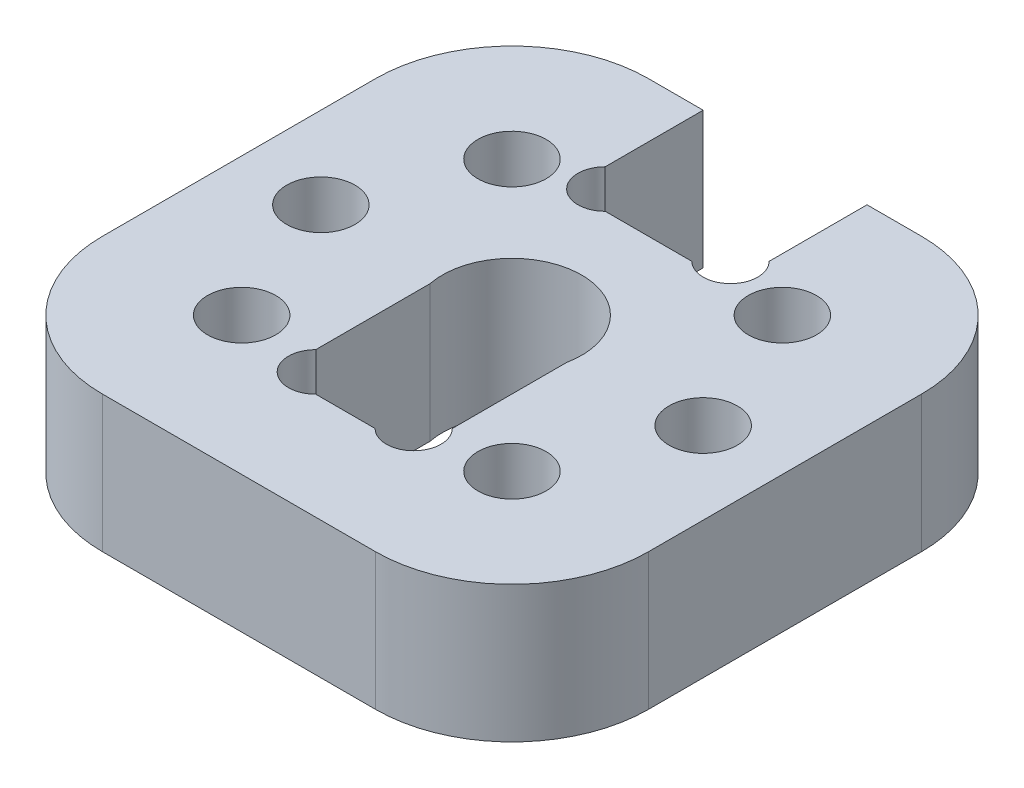
ISO-10303-21;
HEADER;
FILE_DESCRIPTION(('STEP AP214'),'2;1');
FILE_NAME('part.step','',(''),(''),'','','');
FILE_SCHEMA(('AUTOMOTIVE_DESIGN { 1 0 10303 214 1 1 1 1 }'));
ENDSEC;
DATA;
#1=APPLICATION_CONTEXT('core data for automotive mechanical design processes');
#2=APPLICATION_PROTOCOL_DEFINITION('international standard','automotive_design',2000,#1);
#3=PRODUCT_CONTEXT('',#1,'mechanical');
#4=PRODUCT('Part','Part','',(#3));
#5=PRODUCT_RELATED_PRODUCT_CATEGORY('part','',(#4));
#6=PRODUCT_DEFINITION_FORMATION('','',#4);
#7=PRODUCT_DEFINITION_CONTEXT('part definition',#1,'design');
#8=PRODUCT_DEFINITION('design','',#6,#7);
#9=PRODUCT_DEFINITION_SHAPE('','',#8);
#10=(LENGTH_UNIT() NAMED_UNIT(*) SI_UNIT(.MILLI.,.METRE.));
#11=(NAMED_UNIT(*) PLANE_ANGLE_UNIT() SI_UNIT($,.RADIAN.));
#12=(NAMED_UNIT(*) SI_UNIT($,.STERADIAN.) SOLID_ANGLE_UNIT());
#13=UNCERTAINTY_MEASURE_WITH_UNIT(LENGTH_MEASURE(1.E-05),#10,'distance_accuracy_value','');
#14=(GEOMETRIC_REPRESENTATION_CONTEXT(3) GLOBAL_UNCERTAINTY_ASSIGNED_CONTEXT((#13)) GLOBAL_UNIT_ASSIGNED_CONTEXT((#10,
#11,#12)) REPRESENTATION_CONTEXT('',''));
#15=CARTESIAN_POINT('',(0.,0.,0.));
#16=DIRECTION('',(0.,0.,1.));
#17=DIRECTION('',(1.,0.,0.));
#18=AXIS2_PLACEMENT_3D('',#15,#16,#17);
#19=CARTESIAN_POINT('',(-10.,5.,-9.99999999999999));
#20=DIRECTION('',(0.,0.,1.));
#21=DIRECTION('',(1.,0.,0.));
#22=AXIS2_PLACEMENT_3D('',#19,#20,#21);
#23=PLANE('',#22);
#24=DIRECTION('',(-1.,0.,0.));
#25=VECTOR('',#24,1.);
#26=CARTESIAN_POINT('',(-10.,5.,-9.99999999999999));
#27=LINE('',#26,#25);
#28=CARTESIAN_POINT('',(-3.,5.,-9.99999999999999));
#29=VERTEX_POINT('',#28);
#30=CARTESIAN_POINT('',(-5.00000000000001,5.,-9.99999999999999));
#31=VERTEX_POINT('',#30);
#32=EDGE_CURVE('E249',#29,#31,#27,.T.);
#33=ORIENTED_EDGE('',*,*,#32,.F.);
#34=DIRECTION('',(0.,-1.,0.));
#35=VECTOR('',#34,1.);
#36=CARTESIAN_POINT('',(-3.,10.,-9.99999999999999));
#37=LINE('',#36,#35);
#38=CARTESIAN_POINT('',(-3.,0.,-9.99999999999999));
#39=VERTEX_POINT('',#38);
#40=EDGE_CURVE('E190',#29,#39,#37,.T.);
#41=ORIENTED_EDGE('',*,*,#40,.T.);
#42=DIRECTION('',(-1.,0.,0.));
#43=VECTOR('',#42,1.);
#44=CARTESIAN_POINT('',(-10.,0.,-9.99999999999999));
#45=LINE('',#44,#43);
#46=CARTESIAN_POINT('',(-5.00000000000001,0.,-9.99999999999999));
#47=VERTEX_POINT('',#46);
#48=EDGE_CURVE('E263',#39,#47,#45,.T.);
#49=ORIENTED_EDGE('',*,*,#48,.T.);
#50=DIRECTION('',(0.,-1.,0.));
#51=VECTOR('',#50,1.);
#52=CARTESIAN_POINT('',(-5.00000000000001,5.,-9.99999999999999));
#53=LINE('',#52,#51);
#54=EDGE_CURVE('E283',#47,#31,#53,.F.);
#55=ORIENTED_EDGE('',*,*,#54,.T.);
#56=EDGE_LOOP('',(#33,#41,#49,#55));
#57=FACE_BOUND('',#56,.T.);
#58=ADVANCED_FACE('F35',(#57),#23,.F.);
#59=CARTESIAN_POINT('',(9.99999999999999,5.,10.));
#60=DIRECTION('',(-1.,0.,0.));
#61=DIRECTION('',(0.,0.,1.));
#62=AXIS2_PLACEMENT_3D('',#59,#60,#61);
#63=PLANE('',#62);
#64=DIRECTION('',(0.,0.,-1.));
#65=VECTOR('',#64,1.);
#66=CARTESIAN_POINT('',(9.99999999999999,0.,10.));
#67=LINE('',#66,#65);
#68=CARTESIAN_POINT('',(9.99999999999999,0.,5.00000000000001));
#69=VERTEX_POINT('',#68);
#70=CARTESIAN_POINT('',(9.99999999999999,0.,-4.99999999999999));
#71=VERTEX_POINT('',#70);
#72=EDGE_CURVE('E243',#69,#71,#67,.T.);
#73=ORIENTED_EDGE('',*,*,#72,.T.);
#74=DIRECTION('',(0.,-1.,0.));
#75=VECTOR('',#74,1.);
#76=CARTESIAN_POINT('',(9.99999999999999,5.,-4.99999999999999));
#77=LINE('',#76,#75);
#78=CARTESIAN_POINT('',(9.99999999999999,5.,-4.99999999999999));
#79=VERTEX_POINT('',#78);
#80=EDGE_CURVE('E301',#71,#79,#77,.F.);
#81=ORIENTED_EDGE('',*,*,#80,.T.);
#82=DIRECTION('',(0.,0.,-1.));
#83=VECTOR('',#82,1.);
#84=CARTESIAN_POINT('',(9.99999999999999,5.,10.));
#85=LINE('',#84,#83);
#86=CARTESIAN_POINT('',(9.99999999999999,5.,5.00000000000001));
#87=VERTEX_POINT('',#86);
#88=EDGE_CURVE('E246',#87,#79,#85,.T.);
#89=ORIENTED_EDGE('',*,*,#88,.F.);
#90=DIRECTION('',(0.,-1.,0.));
#91=VECTOR('',#90,1.);
#92=CARTESIAN_POINT('',(9.99999999999999,5.,5.00000000000001));
#93=LINE('',#92,#91);
#94=EDGE_CURVE('E298',#87,#69,#93,.T.);
#95=ORIENTED_EDGE('',*,*,#94,.T.);
#96=EDGE_LOOP('',(#73,#81,#89,#95));
#97=FACE_BOUND('',#96,.T.);
#98=ADVANCED_FACE('F337',(#97),#63,.F.);
#99=CARTESIAN_POINT('',(4.99999999999999,0.,-9.99999999999999));
#100=VERTEX_POINT('',#99);
#101=CARTESIAN_POINT('',(3.,0.,-9.99999999999999));
#102=VERTEX_POINT('',#101);
#103=EDGE_CURVE('E264',#100,#102,#45,.T.);
#104=ORIENTED_EDGE('',*,*,#103,.T.);
#105=DIRECTION('',(0.,-1.,0.));
#106=VECTOR('',#105,1.);
#107=CARTESIAN_POINT('',(3.,10.,-9.99999999999999));
#108=LINE('',#107,#106);
#109=CARTESIAN_POINT('',(3.,5.,-9.99999999999999));
#110=VERTEX_POINT('',#109);
#111=EDGE_CURVE('E194',#110,#102,#108,.T.);
#112=ORIENTED_EDGE('',*,*,#111,.F.);
#113=CARTESIAN_POINT('',(4.99999999999999,5.,-9.99999999999999));
#114=VERTEX_POINT('',#113);
#115=EDGE_CURVE('E251',#114,#110,#27,.T.);
#116=ORIENTED_EDGE('',*,*,#115,.F.);
#117=DIRECTION('',(0.,-1.,0.));
#118=VECTOR('',#117,1.);
#119=CARTESIAN_POINT('',(4.99999999999999,5.,-9.99999999999999));
#120=LINE('',#119,#118);
#121=EDGE_CURVE('E286',#114,#100,#120,.T.);
#122=ORIENTED_EDGE('',*,*,#121,.T.);
#123=EDGE_LOOP('',(#104,#112,#116,#122));
#124=FACE_BOUND('',#123,.T.);
#125=ADVANCED_FACE('F330',(#124),#23,.F.);
#126=CARTESIAN_POINT('',(-10.,5.,10.));
#127=DIRECTION('',(1.,0.,0.));
#128=DIRECTION('',(0.,0.,-1.));
#129=AXIS2_PLACEMENT_3D('',#126,#127,#128);
#130=PLANE('',#129);
#131=DIRECTION('',(0.,0.,1.));
#132=VECTOR('',#131,1.);
#133=CARTESIAN_POINT('',(-10.,5.,10.));
#134=LINE('',#133,#132);
#135=CARTESIAN_POINT('',(-10.,5.,-4.99999999999999));
#136=VERTEX_POINT('',#135);
#137=CARTESIAN_POINT('',(-10.,5.,5.00000000000001));
#138=VERTEX_POINT('',#137);
#139=EDGE_CURVE('E254',#136,#138,#134,.T.);
#140=ORIENTED_EDGE('',*,*,#139,.F.);
#141=DIRECTION('',(0.,-1.,0.));
#142=VECTOR('',#141,1.);
#143=CARTESIAN_POINT('',(-10.,5.,-4.99999999999999));
#144=LINE('',#143,#142);
#145=CARTESIAN_POINT('',(-10.,0.,-4.99999999999999));
#146=VERTEX_POINT('',#145);
#147=EDGE_CURVE('E313',#136,#146,#144,.T.);
#148=ORIENTED_EDGE('',*,*,#147,.T.);
#149=DIRECTION('',(0.,0.,1.));
#150=VECTOR('',#149,1.);
#151=CARTESIAN_POINT('',(-10.,0.,10.));
#152=LINE('',#151,#150);
#153=CARTESIAN_POINT('',(-10.,0.,5.00000000000001));
#154=VERTEX_POINT('',#153);
#155=EDGE_CURVE('E267',#146,#154,#152,.T.);
#156=ORIENTED_EDGE('',*,*,#155,.T.);
#157=DIRECTION('',(0.,-1.,0.));
#158=VECTOR('',#157,1.);
#159=CARTESIAN_POINT('',(-10.,5.,5.00000000000001));
#160=LINE('',#159,#158);
#161=EDGE_CURVE('E311',#154,#138,#160,.F.);
#162=ORIENTED_EDGE('',*,*,#161,.T.);
#163=EDGE_LOOP('',(#140,#148,#156,#162));
#164=FACE_BOUND('',#163,.T.);
#165=ADVANCED_FACE('F355',(#164),#130,.F.);
#166=CARTESIAN_POINT('',(-10.,5.,10.));
#167=DIRECTION('',(0.,0.,-1.));
#168=DIRECTION('',(-1.,0.,0.));
#169=AXIS2_PLACEMENT_3D('',#166,#167,#168);
#170=PLANE('',#169);
#171=DIRECTION('',(1.,0.,0.));
#172=VECTOR('',#171,1.);
#173=CARTESIAN_POINT('',(-10.,5.,10.));
#174=LINE('',#173,#172);
#175=CARTESIAN_POINT('',(-5.00000000000001,5.,10.));
#176=VERTEX_POINT('',#175);
#177=CARTESIAN_POINT('',(4.99999999999999,5.,10.));
#178=VERTEX_POINT('',#177);
#179=EDGE_CURVE('E257',#176,#178,#174,.T.);
#180=ORIENTED_EDGE('',*,*,#179,.F.);
#181=DIRECTION('',(0.,-1.,0.));
#182=VECTOR('',#181,1.);
#183=CARTESIAN_POINT('',(-5.00000000000001,5.,10.));
#184=LINE('',#183,#182);
#185=CARTESIAN_POINT('',(-5.00000000000001,0.,10.));
#186=VERTEX_POINT('',#185);
#187=EDGE_CURVE('E318',#176,#186,#184,.T.);
#188=ORIENTED_EDGE('',*,*,#187,.T.);
#189=DIRECTION('',(1.,0.,0.));
#190=VECTOR('',#189,1.);
#191=CARTESIAN_POINT('',(-10.,0.,10.));
#192=LINE('',#191,#190);
#193=CARTESIAN_POINT('',(4.99999999999999,0.,10.));
#194=VERTEX_POINT('',#193);
#195=EDGE_CURVE('E250',#186,#194,#192,.T.);
#196=ORIENTED_EDGE('',*,*,#195,.T.);
#197=DIRECTION('',(0.,-1.,0.));
#198=VECTOR('',#197,1.);
#199=CARTESIAN_POINT('',(4.99999999999999,5.,10.));
#200=LINE('',#199,#198);
#201=EDGE_CURVE('E316',#194,#178,#200,.F.);
#202=ORIENTED_EDGE('',*,*,#201,.T.);
#203=EDGE_LOOP('',(#180,#188,#196,#202));
#204=FACE_BOUND('',#203,.T.);
#205=ADVANCED_FACE('F346',(#204),#170,.F.);
#206=CARTESIAN_POINT('',(0.,5.,0.));
#207=DIRECTION('',(0.,-1.,0.));
#208=DIRECTION('',(0.,0.,-1.));
#209=AXIS2_PLACEMENT_3D('',#206,#207,#208);
#210=PLANE('',#209);
#211=CARTESIAN_POINT('',(-4.94974746830586,5.,4.94974746830416));
#212=DIRECTION('',(0.,-1.,0.));
#213=DIRECTION('',(0.,0.,-1.));
#214=AXIS2_PLACEMENT_3D('',#211,#212,#213);
#215=CIRCLE('',#214,1.2500000000001);
#216=CARTESIAN_POINT('',(-4.94974746830586,5.,3.69974746830406));
#217=VERTEX_POINT('',#216);
#218=EDGE_CURVE('E402',#217,#217,#215,.T.);
#219=ORIENTED_EDGE('',*,*,#218,.T.);
#220=EDGE_LOOP('',(#219));
#221=FACE_BOUND('',#220,.T.);
#222=CARTESIAN_POINT('',(-6.99999999999918,5.,-2.02008441066855E-12));
#223=DIRECTION('',(0.,-1.,0.));
#224=DIRECTION('',(0.,0.,-1.));
#225=AXIS2_PLACEMENT_3D('',#222,#223,#224);
#226=CIRCLE('',#225,1.25000000000021);
#227=CARTESIAN_POINT('',(-6.99999999999918,5.,-1.25000000000223));
#228=VERTEX_POINT('',#227);
#229=EDGE_CURVE('E396',#228,#228,#226,.T.);
#230=ORIENTED_EDGE('',*,*,#229,.T.);
#231=EDGE_LOOP('',(#230));
#232=FACE_BOUND('',#231,.T.);
#233=CARTESIAN_POINT('',(-4.94974746830417,5.,-4.9497474683075));
#234=DIRECTION('',(0.,-1.,0.));
#235=DIRECTION('',(0.,0.,-1.));
#236=AXIS2_PLACEMENT_3D('',#233,#234,#235);
#237=CIRCLE('',#236,1.25000000000019);
#238=CARTESIAN_POINT('',(-4.94974746830417,5.,-6.19974746830769));
#239=VERTEX_POINT('',#238);
#240=EDGE_CURVE('E390',#239,#239,#237,.T.);
#241=ORIENTED_EDGE('',*,*,#240,.T.);
#242=EDGE_LOOP('',(#241));
#243=FACE_BOUND('',#242,.T.);
#244=CARTESIAN_POINT('',(4.9497474683075,5.,-4.94974746830581));
#245=DIRECTION('',(0.,-1.,0.));
#246=DIRECTION('',(0.,0.,-1.));
#247=AXIS2_PLACEMENT_3D('',#244,#245,#246);
#248=CIRCLE('',#247,1.2499999999999);
#249=CARTESIAN_POINT('',(4.9497474683075,5.,-6.19974746830571));
#250=VERTEX_POINT('',#249);
#251=EDGE_CURVE('E384',#250,#250,#248,.T.);
#252=ORIENTED_EDGE('',*,*,#251,.T.);
#253=EDGE_LOOP('',(#252));
#254=FACE_BOUND('',#253,.T.);
#255=CARTESIAN_POINT('',(7.00000000000082,5.,3.77099601951891E-13));
#256=DIRECTION('',(0.,-1.,0.));
#257=DIRECTION('',(0.,0.,-1.));
#258=AXIS2_PLACEMENT_3D('',#255,#256,#257);
#259=CIRCLE('',#258,1.24999999999979);
#260=CARTESIAN_POINT('',(7.00000000000082,5.,-1.24999999999941));
#261=VERTEX_POINT('',#260);
#262=EDGE_CURVE('E378',#261,#261,#259,.T.);
#263=ORIENTED_EDGE('',*,*,#262,.T.);
#264=EDGE_LOOP('',(#263));
#265=FACE_BOUND('',#264,.T.);
#266=CARTESIAN_POINT('',(4.94974746830581,5.,4.94974746830586));
#267=DIRECTION('',(0.,-1.,0.));
#268=DIRECTION('',(0.,0.,-1.));
#269=AXIS2_PLACEMENT_3D('',#266,#267,#268);
#270=CIRCLE('',#269,1.24999999999981);
#271=CARTESIAN_POINT('',(4.94974746830581,5.,3.69974746830605));
#272=VERTEX_POINT('',#271);
#273=EDGE_CURVE('E181',#272,#272,#270,.T.);
#274=ORIENTED_EDGE('',*,*,#273,.T.);
#275=EDGE_LOOP('',(#274));
#276=FACE_BOUND('',#275,.T.);
#277=DIRECTION('',(-1.,0.,0.));
#278=VECTOR('',#277,1.);
#279=CARTESIAN_POINT('',(-2.50000000000006,5.,6.10000000000002));
#280=LINE('',#279,#278);
#281=CARTESIAN_POINT('',(1.08578643762685,5.,6.10000000000002));
#282=VERTEX_POINT('',#281);
#283=CARTESIAN_POINT('',(-1.08578643762696,5.,6.10000000000002));
#284=VERTEX_POINT('',#283);
#285=EDGE_CURVE('E230',#282,#284,#280,.T.);
#286=ORIENTED_EDGE('',*,*,#285,.T.);
#287=CARTESIAN_POINT('',(-1.79289321881351,5.,5.39289321881347));
#288=DIRECTION('',(0.,-1.,0.));
#289=DIRECTION('',(0.,0.,-1.));
#290=AXIS2_PLACEMENT_3D('',#287,#288,#289);
#291=CIRCLE('',#290,1.);
#292=CARTESIAN_POINT('',(-2.50000000000006,5.,4.68578643762693));
#293=VERTEX_POINT('',#292);
#294=EDGE_CURVE('E210',#284,#293,#291,.T.);
#295=ORIENTED_EDGE('',*,*,#294,.T.);
#296=DIRECTION('',(0.,0.,-1.));
#297=VECTOR('',#296,1.);
#298=CARTESIAN_POINT('',(-2.50000000000006,5.,6.10000000000002));
#299=LINE('',#298,#297);
#300=CARTESIAN_POINT('',(-2.50000000000006,5.,0.50249378105576));
#301=VERTEX_POINT('',#300);
#302=EDGE_CURVE('E224',#293,#301,#299,.T.);
#303=ORIENTED_EDGE('',*,*,#302,.T.);
#304=CARTESIAN_POINT('',(0.,5.,0.));
#305=DIRECTION('',(0.,1.,0.));
#306=DIRECTION('',(0.,0.,1.));
#307=AXIS2_PLACEMENT_3D('',#304,#305,#306);
#308=CIRCLE('',#307,2.55);
#309=CARTESIAN_POINT('',(2.49999999999994,5.,0.502493781056325));
#310=VERTEX_POINT('',#309);
#311=EDGE_CURVE('E233',#310,#301,#308,.T.);
#312=ORIENTED_EDGE('',*,*,#311,.F.);
#313=DIRECTION('',(0.,0.,1.));
#314=VECTOR('',#313,1.);
#315=CARTESIAN_POINT('',(2.49999999999994,5.,6.10000000000002));
#316=LINE('',#315,#314);
#317=CARTESIAN_POINT('',(2.49999999999994,5.,4.68578643762692));
#318=VERTEX_POINT('',#317);
#319=EDGE_CURVE('E226',#310,#318,#316,.T.);
#320=ORIENTED_EDGE('',*,*,#319,.T.);
#321=CARTESIAN_POINT('',(1.7928932188134,5.,5.39289321881347));
#322=DIRECTION('',(0.,-1.,0.));
#323=DIRECTION('',(0.,0.,-1.));
#324=AXIS2_PLACEMENT_3D('',#321,#322,#323);
#325=CIRCLE('',#324,1.);
#326=EDGE_CURVE('E219',#318,#282,#325,.T.);
#327=ORIENTED_EDGE('',*,*,#326,.T.);
#328=EDGE_LOOP('',(#286,#295,#303,#312,#320,#327));
#329=FACE_BOUND('',#328,.T.);
#330=DIRECTION('',(-1.,0.,0.));
#331=VECTOR('',#330,1.);
#332=CARTESIAN_POINT('',(0.,5.,-4.99999999999999));
#333=LINE('',#332,#331);
#334=CARTESIAN_POINT('',(1.58578643762691,5.,-4.99999999999999));
#335=VERTEX_POINT('',#334);
#336=CARTESIAN_POINT('',(-1.58578643762689,5.,-4.99999999999999));
#337=VERTEX_POINT('',#336);
#338=EDGE_CURVE('E204',#335,#337,#333,.T.);
#339=ORIENTED_EDGE('',*,*,#338,.T.);
#340=CARTESIAN_POINT('',(-2.29289321881344,5.,-5.70710678118654));
#341=DIRECTION('',(0.,-1.,0.));
#342=DIRECTION('',(0.,0.,-1.));
#343=AXIS2_PLACEMENT_3D('',#340,#341,#342);
#344=CIRCLE('',#343,0.999999999999999);
#345=CARTESIAN_POINT('',(-3.,5.,-6.41421356237308));
#346=VERTEX_POINT('',#345);
#347=EDGE_CURVE('E50',#337,#346,#344,.T.);
#348=ORIENTED_EDGE('',*,*,#347,.T.);
#349=DIRECTION('',(0.,0.,-1.));
#350=VECTOR('',#349,1.);
#351=CARTESIAN_POINT('',(-3.,5.,0.));
#352=LINE('',#351,#350);
#353=EDGE_CURVE('E206',#346,#29,#352,.T.);
#354=ORIENTED_EDGE('',*,*,#353,.T.);
#355=ORIENTED_EDGE('',*,*,#32,.T.);
#356=CARTESIAN_POINT('',(-5.00000000000001,5.,-4.99999999999999));
#357=DIRECTION('',(0.,-1.,0.));
#358=DIRECTION('',(0.,0.,-1.));
#359=AXIS2_PLACEMENT_3D('',#356,#357,#358);
#360=CIRCLE('',#359,5.);
#361=EDGE_CURVE('E307',#31,#136,#360,.F.);
#362=ORIENTED_EDGE('',*,*,#361,.T.);
#363=ORIENTED_EDGE('',*,*,#139,.T.);
#364=CARTESIAN_POINT('',(-5.00000000000001,5.,5.00000000000001));
#365=DIRECTION('',(0.,-1.,0.));
#366=DIRECTION('',(0.,0.,-1.));
#367=AXIS2_PLACEMENT_3D('',#364,#365,#366);
#368=CIRCLE('',#367,5.);
#369=EDGE_CURVE('E305',#138,#176,#368,.F.);
#370=ORIENTED_EDGE('',*,*,#369,.T.);
#371=ORIENTED_EDGE('',*,*,#179,.T.);
#372=CARTESIAN_POINT('',(4.99999999999999,5.,5.00000000000001));
#373=DIRECTION('',(0.,-1.,0.));
#374=DIRECTION('',(0.,0.,-1.));
#375=AXIS2_PLACEMENT_3D('',#372,#373,#374);
#376=CIRCLE('',#375,5.);
#377=EDGE_CURVE('E303',#178,#87,#376,.F.);
#378=ORIENTED_EDGE('',*,*,#377,.T.);
#379=ORIENTED_EDGE('',*,*,#88,.T.);
#380=CARTESIAN_POINT('',(4.99999999999999,5.,-4.99999999999999));
#381=DIRECTION('',(0.,-1.,0.));
#382=DIRECTION('',(0.,0.,-1.));
#383=AXIS2_PLACEMENT_3D('',#380,#381,#382);
#384=CIRCLE('',#383,5.);
#385=EDGE_CURVE('E309',#79,#114,#384,.F.);
#386=ORIENTED_EDGE('',*,*,#385,.T.);
#387=ORIENTED_EDGE('',*,*,#115,.T.);
#388=DIRECTION('',(0.,0.,1.));
#389=VECTOR('',#388,1.);
#390=CARTESIAN_POINT('',(3.,5.,0.));
#391=LINE('',#390,#389);
#392=CARTESIAN_POINT('',(3.,5.,-6.41421356237309));
#393=VERTEX_POINT('',#392);
#394=EDGE_CURVE('E200',#110,#393,#391,.T.);
#395=ORIENTED_EDGE('',*,*,#394,.T.);
#396=CARTESIAN_POINT('',(2.29289321881346,5.,-5.70710678118654));
#397=DIRECTION('',(0.,-1.,0.));
#398=DIRECTION('',(0.,0.,-1.));
#399=AXIS2_PLACEMENT_3D('',#396,#397,#398);
#400=CIRCLE('',#399,1.);
#401=EDGE_CURVE('E57',#393,#335,#400,.T.);
#402=ORIENTED_EDGE('',*,*,#401,.T.);
#403=EDGE_LOOP('',(#339,#348,#354,#355,#362,#363,#370,#371,#378,#379,#386,#387,#395,#402));
#404=FACE_BOUND('',#403,.T.);
#405=ADVANCED_FACE('F325',(#221,#232,#243,#254,#265,#276,#329,#404),#210,.F.);
#406=CARTESIAN_POINT('',(0.,0.,0.));
#407=DIRECTION('',(0.,-1.,0.));
#408=DIRECTION('',(0.,0.,-1.));
#409=AXIS2_PLACEMENT_3D('',#406,#407,#408);
#410=PLANE('',#409);
#411=CARTESIAN_POINT('',(-4.94974746830586,0.,4.94974746830416));
#412=DIRECTION('',(0.,-1.,0.));
#413=DIRECTION('',(0.,0.,-1.));
#414=AXIS2_PLACEMENT_3D('',#411,#412,#413);
#415=CIRCLE('',#414,1.2500000000001);
#416=CARTESIAN_POINT('',(-4.94974746830586,0.,3.69974746830406));
#417=VERTEX_POINT('',#416);
#418=EDGE_CURVE('E405',#417,#417,#415,.T.);
#419=ORIENTED_EDGE('',*,*,#418,.F.);
#420=EDGE_LOOP('',(#419));
#421=FACE_BOUND('',#420,.T.);
#422=CARTESIAN_POINT('',(-6.99999999999918,0.,-2.02008441066855E-12));
#423=DIRECTION('',(0.,-1.,0.));
#424=DIRECTION('',(0.,0.,-1.));
#425=AXIS2_PLACEMENT_3D('',#422,#423,#424);
#426=CIRCLE('',#425,1.25000000000021);
#427=CARTESIAN_POINT('',(-6.99999999999918,0.,-1.25000000000223));
#428=VERTEX_POINT('',#427);
#429=EDGE_CURVE('E399',#428,#428,#426,.T.);
#430=ORIENTED_EDGE('',*,*,#429,.F.);
#431=EDGE_LOOP('',(#430));
#432=FACE_BOUND('',#431,.T.);
#433=CARTESIAN_POINT('',(-4.94974746830417,0.,-4.9497474683075));
#434=DIRECTION('',(0.,-1.,0.));
#435=DIRECTION('',(0.,0.,-1.));
#436=AXIS2_PLACEMENT_3D('',#433,#434,#435);
#437=CIRCLE('',#436,1.25000000000019);
#438=CARTESIAN_POINT('',(-4.94974746830417,0.,-6.19974746830769));
#439=VERTEX_POINT('',#438);
#440=EDGE_CURVE('E393',#439,#439,#437,.T.);
#441=ORIENTED_EDGE('',*,*,#440,.F.);
#442=EDGE_LOOP('',(#441));
#443=FACE_BOUND('',#442,.T.);
#444=CARTESIAN_POINT('',(4.9497474683075,0.,-4.94974746830581));
#445=DIRECTION('',(0.,-1.,0.));
#446=DIRECTION('',(0.,0.,-1.));
#447=AXIS2_PLACEMENT_3D('',#444,#445,#446);
#448=CIRCLE('',#447,1.2499999999999);
#449=CARTESIAN_POINT('',(4.9497474683075,0.,-6.19974746830571));
#450=VERTEX_POINT('',#449);
#451=EDGE_CURVE('E387',#450,#450,#448,.T.);
#452=ORIENTED_EDGE('',*,*,#451,.F.);
#453=EDGE_LOOP('',(#452));
#454=FACE_BOUND('',#453,.T.);
#455=CARTESIAN_POINT('',(7.00000000000082,0.,3.77099601951891E-13));
#456=DIRECTION('',(0.,-1.,0.));
#457=DIRECTION('',(0.,0.,-1.));
#458=AXIS2_PLACEMENT_3D('',#455,#456,#457);
#459=CIRCLE('',#458,1.24999999999979);
#460=CARTESIAN_POINT('',(7.00000000000082,0.,-1.24999999999941));
#461=VERTEX_POINT('',#460);
#462=EDGE_CURVE('E381',#461,#461,#459,.T.);
#463=ORIENTED_EDGE('',*,*,#462,.F.);
#464=EDGE_LOOP('',(#463));
#465=FACE_BOUND('',#464,.T.);
#466=CARTESIAN_POINT('',(4.94974746830581,0.,4.94974746830586));
#467=DIRECTION('',(0.,-1.,0.));
#468=DIRECTION('',(0.,0.,-1.));
#469=AXIS2_PLACEMENT_3D('',#466,#467,#468);
#470=CIRCLE('',#469,1.24999999999981);
#471=CARTESIAN_POINT('',(4.94974746830581,0.,3.69974746830605));
#472=VERTEX_POINT('',#471);
#473=EDGE_CURVE('E375',#472,#472,#470,.T.);
#474=ORIENTED_EDGE('',*,*,#473,.F.);
#475=EDGE_LOOP('',(#474));
#476=FACE_BOUND('',#475,.T.);
#477=CARTESIAN_POINT('',(-2.29289321881344,0.,-5.70710678118654));
#478=DIRECTION('',(0.,-1.,0.));
#479=DIRECTION('',(0.,0.,-1.));
#480=AXIS2_PLACEMENT_3D('',#477,#478,#479);
#481=CIRCLE('',#480,0.999999999999999);
#482=CARTESIAN_POINT('',(-1.58578643762689,0.,-4.99999999999999));
#483=VERTEX_POINT('',#482);
#484=CARTESIAN_POINT('',(-3.,0.,-6.41421356237308));
#485=VERTEX_POINT('',#484);
#486=EDGE_CURVE('E173',#483,#485,#481,.T.);
#487=ORIENTED_EDGE('',*,*,#486,.F.);
#488=DIRECTION('',(-1.,0.,0.));
#489=VECTOR('',#488,1.);
#490=CARTESIAN_POINT('',(-3.,0.,-4.99999999999999));
#491=LINE('',#490,#489);
#492=CARTESIAN_POINT('',(1.58578643762691,0.,-4.99999999999999));
#493=VERTEX_POINT('',#492);
#494=EDGE_CURVE('E177',#493,#483,#491,.T.);
#495=ORIENTED_EDGE('',*,*,#494,.F.);
#496=CARTESIAN_POINT('',(2.29289321881346,0.,-5.70710678118654));
#497=DIRECTION('',(0.,-1.,0.));
#498=DIRECTION('',(0.,0.,-1.));
#499=AXIS2_PLACEMENT_3D('',#496,#497,#498);
#500=CIRCLE('',#499,1.);
#501=CARTESIAN_POINT('',(3.,0.,-6.41421356237309));
#502=VERTEX_POINT('',#501);
#503=EDGE_CURVE('E371',#502,#493,#500,.T.);
#504=ORIENTED_EDGE('',*,*,#503,.F.);
#505=DIRECTION('',(0.,0.,1.));
#506=VECTOR('',#505,1.);
#507=CARTESIAN_POINT('',(3.,0.,-4.99999999999999));
#508=LINE('',#507,#506);
#509=EDGE_CURVE('E191',#102,#502,#508,.T.);
#510=ORIENTED_EDGE('',*,*,#509,.F.);
#511=ORIENTED_EDGE('',*,*,#103,.F.);
#512=CARTESIAN_POINT('',(4.99999999999999,0.,-4.99999999999999));
#513=DIRECTION('',(0.,-1.,0.));
#514=DIRECTION('',(0.,0.,-1.));
#515=AXIS2_PLACEMENT_3D('',#512,#513,#514);
#516=CIRCLE('',#515,5.);
#517=EDGE_CURVE('E296',#100,#71,#516,.T.);
#518=ORIENTED_EDGE('',*,*,#517,.T.);
#519=ORIENTED_EDGE('',*,*,#72,.F.);
#520=CARTESIAN_POINT('',(4.99999999999999,0.,5.00000000000001));
#521=DIRECTION('',(0.,-1.,0.));
#522=DIRECTION('',(0.,0.,-1.));
#523=AXIS2_PLACEMENT_3D('',#520,#521,#522);
#524=CIRCLE('',#523,5.);
#525=EDGE_CURVE('E289',#69,#194,#524,.T.);
#526=ORIENTED_EDGE('',*,*,#525,.T.);
#527=ORIENTED_EDGE('',*,*,#195,.F.);
#528=CARTESIAN_POINT('',(-5.00000000000001,0.,5.00000000000001));
#529=DIRECTION('',(0.,-1.,0.));
#530=DIRECTION('',(0.,0.,-1.));
#531=AXIS2_PLACEMENT_3D('',#528,#529,#530);
#532=CIRCLE('',#531,5.);
#533=EDGE_CURVE('E291',#186,#154,#532,.T.);
#534=ORIENTED_EDGE('',*,*,#533,.T.);
#535=ORIENTED_EDGE('',*,*,#155,.F.);
#536=CARTESIAN_POINT('',(-5.00000000000001,0.,-4.99999999999999));
#537=DIRECTION('',(0.,-1.,0.));
#538=DIRECTION('',(0.,0.,-1.));
#539=AXIS2_PLACEMENT_3D('',#536,#537,#538);
#540=CIRCLE('',#539,5.);
#541=EDGE_CURVE('E293',#146,#47,#540,.T.);
#542=ORIENTED_EDGE('',*,*,#541,.T.);
#543=ORIENTED_EDGE('',*,*,#48,.F.);
#544=DIRECTION('',(0.,0.,-1.));
#545=VECTOR('',#544,1.);
#546=CARTESIAN_POINT('',(-3.,0.,-4.99999999999999));
#547=LINE('',#546,#545);
#548=EDGE_CURVE('E179',#485,#39,#547,.T.);
#549=ORIENTED_EDGE('',*,*,#548,.F.);
#550=EDGE_LOOP('',(#487,#495,#504,#510,#511,#518,#519,#526,#527,#534,#535,#542,#543,#549));
#551=FACE_BOUND('',#550,.T.);
#552=CARTESIAN_POINT('',(-1.79289321881351,0.,5.39289321881347));
#553=DIRECTION('',(0.,-1.,0.));
#554=DIRECTION('',(0.,0.,-1.));
#555=AXIS2_PLACEMENT_3D('',#552,#553,#554);
#556=CIRCLE('',#555,1.);
#557=CARTESIAN_POINT('',(-1.08578643762696,0.,6.10000000000002));
#558=VERTEX_POINT('',#557);
#559=CARTESIAN_POINT('',(-2.50000000000006,0.,4.68578643762693));
#560=VERTEX_POINT('',#559);
#561=EDGE_CURVE('E208',#558,#560,#556,.T.);
#562=ORIENTED_EDGE('',*,*,#561,.F.);
#563=DIRECTION('',(-1.,0.,0.));
#564=VECTOR('',#563,1.);
#565=CARTESIAN_POINT('',(-2.50000000000006,0.,6.10000000000002));
#566=LINE('',#565,#564);
#567=CARTESIAN_POINT('',(1.08578643762685,0.,6.10000000000002));
#568=VERTEX_POINT('',#567);
#569=EDGE_CURVE('E227',#568,#558,#566,.T.);
#570=ORIENTED_EDGE('',*,*,#569,.F.);
#571=CARTESIAN_POINT('',(1.7928932188134,0.,5.39289321881347));
#572=DIRECTION('',(0.,-1.,0.));
#573=DIRECTION('',(0.,0.,-1.));
#574=AXIS2_PLACEMENT_3D('',#571,#572,#573);
#575=CIRCLE('',#574,1.);
#576=CARTESIAN_POINT('',(2.49999999999994,0.,4.68578643762692));
#577=VERTEX_POINT('',#576);
#578=EDGE_CURVE('E216',#577,#568,#575,.T.);
#579=ORIENTED_EDGE('',*,*,#578,.F.);
#580=DIRECTION('',(0.,0.,1.));
#581=VECTOR('',#580,1.);
#582=CARTESIAN_POINT('',(2.49999999999994,0.,6.10000000000002));
#583=LINE('',#582,#581);
#584=CARTESIAN_POINT('',(2.49999999999994,0.,0.502493781056325));
#585=VERTEX_POINT('',#584);
#586=EDGE_CURVE('E235',#585,#577,#583,.T.);
#587=ORIENTED_EDGE('',*,*,#586,.F.);
#588=CARTESIAN_POINT('',(0.,0.,0.));
#589=DIRECTION('',(0.,1.,0.));
#590=DIRECTION('',(0.,0.,1.));
#591=AXIS2_PLACEMENT_3D('',#588,#589,#590);
#592=CIRCLE('',#591,2.55);
#593=CARTESIAN_POINT('',(-2.50000000000006,0.,0.50249378105576));
#594=VERTEX_POINT('',#593);
#595=EDGE_CURVE('E240',#585,#594,#592,.T.);
#596=ORIENTED_EDGE('',*,*,#595,.T.);
#597=DIRECTION('',(0.,0.,-1.));
#598=VECTOR('',#597,1.);
#599=CARTESIAN_POINT('',(-2.50000000000006,0.,6.10000000000002));
#600=LINE('',#599,#598);
#601=EDGE_CURVE('E221',#560,#594,#600,.T.);
#602=ORIENTED_EDGE('',*,*,#601,.F.);
#603=EDGE_LOOP('',(#562,#570,#579,#587,#596,#602));
#604=FACE_BOUND('',#603,.T.);
#605=ADVANCED_FACE('F174',(#421,#432,#443,#454,#465,#476,#551,#604),#410,.T.);
#606=CARTESIAN_POINT('',(0.,0.,0.));
#607=DIRECTION('',(0.,1.,0.));
#608=DIRECTION('',(0.,0.,1.));
#609=AXIS2_PLACEMENT_3D('',#606,#607,#608);
#610=CYLINDRICAL_SURFACE('',#609,2.55);
#611=ORIENTED_EDGE('',*,*,#311,.T.);
#612=DIRECTION('',(0.,1.,0.));
#613=VECTOR('',#612,1.);
#614=CARTESIAN_POINT('',(-2.50000000000006,0.,0.50249378105576));
#615=LINE('',#614,#613);
#616=EDGE_CURVE('E274',#301,#594,#615,.F.);
#617=ORIENTED_EDGE('',*,*,#616,.T.);
#618=ORIENTED_EDGE('',*,*,#595,.F.);
#619=DIRECTION('',(0.,1.,0.));
#620=VECTOR('',#619,1.);
#621=CARTESIAN_POINT('',(2.49999999999994,0.,0.502493781056325));
#622=LINE('',#621,#620);
#623=EDGE_CURVE('E260',#585,#310,#622,.T.);
#624=ORIENTED_EDGE('',*,*,#623,.T.);
#625=EDGE_LOOP('',(#611,#617,#618,#624));
#626=FACE_BOUND('',#625,.T.);
#627=ADVANCED_FACE('F422',(#626),#610,.F.);
#628=CARTESIAN_POINT('',(-2.50000000000006,5.,6.10000000000002));
#629=DIRECTION('',(-1.,0.,0.));
#630=DIRECTION('',(0.,0.,1.));
#631=AXIS2_PLACEMENT_3D('',#628,#629,#630);
#632=PLANE('',#631);
#633=ORIENTED_EDGE('',*,*,#302,.F.);
#634=DIRECTION('',(0.,-1.,0.));
#635=VECTOR('',#634,1.);
#636=CARTESIAN_POINT('',(-2.50000000000006,10.,4.68578643762693));
#637=LINE('',#636,#635);
#638=EDGE_CURVE('E213',#293,#560,#637,.T.);
#639=ORIENTED_EDGE('',*,*,#638,.T.);
#640=ORIENTED_EDGE('',*,*,#601,.T.);
#641=ORIENTED_EDGE('',*,*,#616,.F.);
#642=EDGE_LOOP('',(#633,#639,#640,#641));
#643=FACE_BOUND('',#642,.T.);
#644=ADVANCED_FACE('F469',(#643),#632,.F.);
#645=CARTESIAN_POINT('',(2.49999999999994,5.,6.10000000000002));
#646=DIRECTION('',(1.,0.,0.));
#647=DIRECTION('',(0.,0.,-1.));
#648=AXIS2_PLACEMENT_3D('',#645,#646,#647);
#649=PLANE('',#648);
#650=ORIENTED_EDGE('',*,*,#586,.T.);
#651=DIRECTION('',(0.,-1.,0.));
#652=VECTOR('',#651,1.);
#653=CARTESIAN_POINT('',(2.49999999999994,10.,4.68578643762692));
#654=LINE('',#653,#652);
#655=EDGE_CURVE('E218',#577,#318,#654,.F.);
#656=ORIENTED_EDGE('',*,*,#655,.T.);
#657=ORIENTED_EDGE('',*,*,#319,.F.);
#658=ORIENTED_EDGE('',*,*,#623,.F.);
#659=EDGE_LOOP('',(#650,#656,#657,#658));
#660=FACE_BOUND('',#659,.T.);
#661=ADVANCED_FACE('F473',(#660),#649,.F.);
#662=CARTESIAN_POINT('',(-2.50000000000006,5.,6.10000000000002));
#663=DIRECTION('',(0.,0.,1.));
#664=DIRECTION('',(1.,0.,0.));
#665=AXIS2_PLACEMENT_3D('',#662,#663,#664);
#666=PLANE('',#665);
#667=ORIENTED_EDGE('',*,*,#569,.T.);
#668=DIRECTION('',(0.,-1.,0.));
#669=VECTOR('',#668,1.);
#670=CARTESIAN_POINT('',(-1.08578643762696,10.,6.10000000000002));
#671=LINE('',#670,#669);
#672=EDGE_CURVE('E280',#558,#284,#671,.F.);
#673=ORIENTED_EDGE('',*,*,#672,.T.);
#674=ORIENTED_EDGE('',*,*,#285,.F.);
#675=DIRECTION('',(0.,-1.,0.));
#676=VECTOR('',#675,1.);
#677=CARTESIAN_POINT('',(1.08578643762685,10.,6.10000000000002));
#678=LINE('',#677,#676);
#679=EDGE_CURVE('E277',#282,#568,#678,.T.);
#680=ORIENTED_EDGE('',*,*,#679,.T.);
#681=EDGE_LOOP('',(#667,#673,#674,#680));
#682=FACE_BOUND('',#681,.T.);
#683=ADVANCED_FACE('F477',(#682),#666,.F.);
#684=CARTESIAN_POINT('',(1.7928932188134,10.,5.39289321881347));
#685=DIRECTION('',(0.,-1.,0.));
#686=DIRECTION('',(0.,0.,-1.));
#687=AXIS2_PLACEMENT_3D('',#684,#685,#686);
#688=CYLINDRICAL_SURFACE('',#687,1.);
#689=ORIENTED_EDGE('',*,*,#655,.F.);
#690=ORIENTED_EDGE('',*,*,#578,.T.);
#691=ORIENTED_EDGE('',*,*,#679,.F.);
#692=ORIENTED_EDGE('',*,*,#326,.F.);
#693=EDGE_LOOP('',(#689,#690,#691,#692));
#694=FACE_BOUND('',#693,.T.);
#695=ADVANCED_FACE('F481',(#694),#688,.F.);
#696=CARTESIAN_POINT('',(-1.79289321881351,10.,5.39289321881347));
#697=DIRECTION('',(0.,-1.,0.));
#698=DIRECTION('',(0.,0.,-1.));
#699=AXIS2_PLACEMENT_3D('',#696,#697,#698);
#700=CYLINDRICAL_SURFACE('',#699,1.);
#701=ORIENTED_EDGE('',*,*,#294,.F.);
#702=ORIENTED_EDGE('',*,*,#672,.F.);
#703=ORIENTED_EDGE('',*,*,#561,.T.);
#704=ORIENTED_EDGE('',*,*,#638,.F.);
#705=EDGE_LOOP('',(#701,#702,#703,#704));
#706=FACE_BOUND('',#705,.T.);
#707=ADVANCED_FACE('F485',(#706),#700,.F.);
#708=CARTESIAN_POINT('',(4.99999999999999,5.,-4.99999999999999));
#709=DIRECTION('',(0.,-1.,0.));
#710=DIRECTION('',(0.,0.,-1.));
#711=AXIS2_PLACEMENT_3D('',#708,#709,#710);
#712=CYLINDRICAL_SURFACE('',#711,5.);
#713=ORIENTED_EDGE('',*,*,#385,.F.);
#714=ORIENTED_EDGE('',*,*,#80,.F.);
#715=ORIENTED_EDGE('',*,*,#517,.F.);
#716=ORIENTED_EDGE('',*,*,#121,.F.);
#717=EDGE_LOOP('',(#713,#714,#715,#716));
#718=FACE_BOUND('',#717,.T.);
#719=ADVANCED_FACE('F333',(#718),#712,.T.);
#720=CARTESIAN_POINT('',(-5.00000000000001,5.,-4.99999999999999));
#721=DIRECTION('',(0.,-1.,0.));
#722=DIRECTION('',(0.,0.,-1.));
#723=AXIS2_PLACEMENT_3D('',#720,#721,#722);
#724=CYLINDRICAL_SURFACE('',#723,5.);
#725=ORIENTED_EDGE('',*,*,#361,.F.);
#726=ORIENTED_EDGE('',*,*,#54,.F.);
#727=ORIENTED_EDGE('',*,*,#541,.F.);
#728=ORIENTED_EDGE('',*,*,#147,.F.);
#729=EDGE_LOOP('',(#725,#726,#727,#728));
#730=FACE_BOUND('',#729,.T.);
#731=ADVANCED_FACE('F359',(#730),#724,.T.);
#732=CARTESIAN_POINT('',(-5.00000000000001,5.,5.00000000000001));
#733=DIRECTION('',(0.,-1.,0.));
#734=DIRECTION('',(0.,0.,-1.));
#735=AXIS2_PLACEMENT_3D('',#732,#733,#734);
#736=CYLINDRICAL_SURFACE('',#735,5.);
#737=ORIENTED_EDGE('',*,*,#369,.F.);
#738=ORIENTED_EDGE('',*,*,#161,.F.);
#739=ORIENTED_EDGE('',*,*,#533,.F.);
#740=ORIENTED_EDGE('',*,*,#187,.F.);
#741=EDGE_LOOP('',(#737,#738,#739,#740));
#742=FACE_BOUND('',#741,.T.);
#743=ADVANCED_FACE('F350',(#742),#736,.T.);
#744=CARTESIAN_POINT('',(4.99999999999999,5.,5.00000000000001));
#745=DIRECTION('',(0.,-1.,0.));
#746=DIRECTION('',(0.,0.,-1.));
#747=AXIS2_PLACEMENT_3D('',#744,#745,#746);
#748=CYLINDRICAL_SURFACE('',#747,5.);
#749=ORIENTED_EDGE('',*,*,#377,.F.);
#750=ORIENTED_EDGE('',*,*,#201,.F.);
#751=ORIENTED_EDGE('',*,*,#525,.F.);
#752=ORIENTED_EDGE('',*,*,#94,.F.);
#753=EDGE_LOOP('',(#749,#750,#751,#752));
#754=FACE_BOUND('',#753,.T.);
#755=ADVANCED_FACE('F37',(#754),#748,.T.);
#756=CARTESIAN_POINT('',(-3.,10.,-4.99999999999999));
#757=DIRECTION('',(-1.,0.,0.));
#758=DIRECTION('',(0.,0.,1.));
#759=AXIS2_PLACEMENT_3D('',#756,#757,#758);
#760=PLANE('',#759);
#761=ORIENTED_EDGE('',*,*,#353,.F.);
#762=DIRECTION('',(0.,-1.,0.));
#763=VECTOR('',#762,1.);
#764=CARTESIAN_POINT('',(-3.,10.,-6.41421356237308));
#765=LINE('',#764,#763);
#766=EDGE_CURVE('E367',#346,#485,#765,.T.);
#767=ORIENTED_EDGE('',*,*,#766,.T.);
#768=ORIENTED_EDGE('',*,*,#548,.T.);
#769=ORIENTED_EDGE('',*,*,#40,.F.);
#770=EDGE_LOOP('',(#761,#767,#768,#769));
#771=FACE_BOUND('',#770,.T.);
#772=ADVANCED_FACE('F366',(#771),#760,.F.);
#773=CARTESIAN_POINT('',(-3.,10.,-4.99999999999999));
#774=DIRECTION('',(0.,0.,1.));
#775=DIRECTION('',(1.,0.,0.));
#776=AXIS2_PLACEMENT_3D('',#773,#774,#775);
#777=PLANE('',#776);
#778=ORIENTED_EDGE('',*,*,#494,.T.);
#779=DIRECTION('',(0.,-1.,0.));
#780=VECTOR('',#779,1.);
#781=CARTESIAN_POINT('',(-1.58578643762689,10.,-4.99999999999999));
#782=LINE('',#781,#780);
#783=EDGE_CURVE('E11',#483,#337,#782,.F.);
#784=ORIENTED_EDGE('',*,*,#783,.T.);
#785=ORIENTED_EDGE('',*,*,#338,.F.);
#786=DIRECTION('',(0.,-1.,0.));
#787=VECTOR('',#786,1.);
#788=CARTESIAN_POINT('',(1.58578643762691,10.,-4.99999999999999));
#789=LINE('',#788,#787);
#790=EDGE_CURVE('E189',#335,#493,#789,.T.);
#791=ORIENTED_EDGE('',*,*,#790,.T.);
#792=EDGE_LOOP('',(#778,#784,#785,#791));
#793=FACE_BOUND('',#792,.T.);
#794=ADVANCED_FACE('F188',(#793),#777,.F.);
#795=CARTESIAN_POINT('',(3.,10.,-4.99999999999999));
#796=DIRECTION('',(1.,0.,0.));
#797=DIRECTION('',(0.,0.,-1.));
#798=AXIS2_PLACEMENT_3D('',#795,#796,#797);
#799=PLANE('',#798);
#800=ORIENTED_EDGE('',*,*,#509,.T.);
#801=DIRECTION('',(0.,-1.,0.));
#802=VECTOR('',#801,1.);
#803=CARTESIAN_POINT('',(3.,10.,-6.41421356237309));
#804=LINE('',#803,#802);
#805=EDGE_CURVE('E43',#502,#393,#804,.F.);
#806=ORIENTED_EDGE('',*,*,#805,.T.);
#807=ORIENTED_EDGE('',*,*,#394,.F.);
#808=ORIENTED_EDGE('',*,*,#111,.T.);
#809=EDGE_LOOP('',(#800,#806,#807,#808));
#810=FACE_BOUND('',#809,.T.);
#811=ADVANCED_FACE('F321',(#810),#799,.F.);
#812=CARTESIAN_POINT('',(2.29289321881346,10.,-5.70710678118654));
#813=DIRECTION('',(0.,-1.,0.));
#814=DIRECTION('',(0.,0.,-1.));
#815=AXIS2_PLACEMENT_3D('',#812,#813,#814);
#816=CYLINDRICAL_SURFACE('',#815,1.);
#817=ORIENTED_EDGE('',*,*,#401,.F.);
#818=ORIENTED_EDGE('',*,*,#805,.F.);
#819=ORIENTED_EDGE('',*,*,#503,.T.);
#820=ORIENTED_EDGE('',*,*,#790,.F.);
#821=EDGE_LOOP('',(#817,#818,#819,#820));
#822=FACE_BOUND('',#821,.T.);
#823=ADVANCED_FACE('F446',(#822),#816,.F.);
#824=CARTESIAN_POINT('',(-2.29289321881344,10.,-5.70710678118654));
#825=DIRECTION('',(0.,-1.,0.));
#826=DIRECTION('',(0.,0.,-1.));
#827=AXIS2_PLACEMENT_3D('',#824,#825,#826);
#828=CYLINDRICAL_SURFACE('',#827,0.999999999999999);
#829=ORIENTED_EDGE('',*,*,#347,.F.);
#830=ORIENTED_EDGE('',*,*,#783,.F.);
#831=ORIENTED_EDGE('',*,*,#486,.T.);
#832=ORIENTED_EDGE('',*,*,#766,.F.);
#833=EDGE_LOOP('',(#829,#830,#831,#832));
#834=FACE_BOUND('',#833,.T.);
#835=ADVANCED_FACE('F183',(#834),#828,.F.);
#836=CARTESIAN_POINT('',(4.94974746830581,5.,4.94974746830586));
#837=DIRECTION('',(0.,-1.,0.));
#838=DIRECTION('',(0.,0.,-1.));
#839=AXIS2_PLACEMENT_3D('',#836,#837,#838);
#840=CYLINDRICAL_SURFACE('',#839,1.24999999999981);
#841=ORIENTED_EDGE('',*,*,#273,.F.);
#842=EDGE_LOOP('',(#841));
#843=FACE_BOUND('',#842,.T.);
#844=ORIENTED_EDGE('',*,*,#473,.T.);
#845=EDGE_LOOP('',(#844));
#846=FACE_BOUND('',#845,.T.);
#847=ADVANCED_FACE('F434',(#843,#846),#840,.F.);
#848=CARTESIAN_POINT('',(7.00000000000082,5.,3.77099601951891E-13));
#849=DIRECTION('',(0.,-1.,0.));
#850=DIRECTION('',(0.,0.,-1.));
#851=AXIS2_PLACEMENT_3D('',#848,#849,#850);
#852=CYLINDRICAL_SURFACE('',#851,1.24999999999979);
#853=ORIENTED_EDGE('',*,*,#262,.F.);
#854=EDGE_LOOP('',(#853));
#855=FACE_BOUND('',#854,.T.);
#856=ORIENTED_EDGE('',*,*,#462,.T.);
#857=EDGE_LOOP('',(#856));
#858=FACE_BOUND('',#857,.T.);
#859=ADVANCED_FACE('F436',(#855,#858),#852,.F.);
#860=CARTESIAN_POINT('',(4.9497474683075,5.,-4.94974746830581));
#861=DIRECTION('',(0.,-1.,0.));
#862=DIRECTION('',(0.,0.,-1.));
#863=AXIS2_PLACEMENT_3D('',#860,#861,#862);
#864=CYLINDRICAL_SURFACE('',#863,1.2499999999999);
#865=ORIENTED_EDGE('',*,*,#251,.F.);
#866=EDGE_LOOP('',(#865));
#867=FACE_BOUND('',#866,.T.);
#868=ORIENTED_EDGE('',*,*,#451,.T.);
#869=EDGE_LOOP('',(#868));
#870=FACE_BOUND('',#869,.T.);
#871=ADVANCED_FACE('F443',(#867,#870),#864,.F.);
#872=CARTESIAN_POINT('',(-4.94974746830417,5.,-4.9497474683075));
#873=DIRECTION('',(0.,-1.,0.));
#874=DIRECTION('',(0.,0.,-1.));
#875=AXIS2_PLACEMENT_3D('',#872,#873,#874);
#876=CYLINDRICAL_SURFACE('',#875,1.25000000000019);
#877=ORIENTED_EDGE('',*,*,#240,.F.);
#878=EDGE_LOOP('',(#877));
#879=FACE_BOUND('',#878,.T.);
#880=ORIENTED_EDGE('',*,*,#440,.T.);
#881=EDGE_LOOP('',(#880));
#882=FACE_BOUND('',#881,.T.);
#883=ADVANCED_FACE('F538',(#879,#882),#876,.F.);
#884=CARTESIAN_POINT('',(-6.99999999999918,5.,-2.02008441066855E-12));
#885=DIRECTION('',(0.,-1.,0.));
#886=DIRECTION('',(0.,0.,-1.));
#887=AXIS2_PLACEMENT_3D('',#884,#885,#886);
#888=CYLINDRICAL_SURFACE('',#887,1.25000000000021);
#889=ORIENTED_EDGE('',*,*,#229,.F.);
#890=EDGE_LOOP('',(#889));
#891=FACE_BOUND('',#890,.T.);
#892=ORIENTED_EDGE('',*,*,#429,.T.);
#893=EDGE_LOOP('',(#892));
#894=FACE_BOUND('',#893,.T.);
#895=ADVANCED_FACE('F416',(#891,#894),#888,.F.);
#896=CARTESIAN_POINT('',(-4.94974746830586,5.,4.94974746830416));
#897=DIRECTION('',(0.,-1.,0.));
#898=DIRECTION('',(0.,0.,-1.));
#899=AXIS2_PLACEMENT_3D('',#896,#897,#898);
#900=CYLINDRICAL_SURFACE('',#899,1.2500000000001);
#901=ORIENTED_EDGE('',*,*,#218,.F.);
#902=EDGE_LOOP('',(#901));
#903=FACE_BOUND('',#902,.T.);
#904=ORIENTED_EDGE('',*,*,#418,.T.);
#905=EDGE_LOOP('',(#904));
#906=FACE_BOUND('',#905,.T.);
#907=ADVANCED_FACE('F413',(#903,#906),#900,.F.);
#908=CLOSED_SHELL('',(#58,#98,#125,#165,#205,#405,#605,#627,#644,#661,#683,#695,#707,#719,#731,
#743,#755,#772,#794,#811,#823,#835,#847,#859,#871,#883,#895,#907));
#909=MANIFOLD_SOLID_BREP('B2',#908);
#910=ADVANCED_BREP_SHAPE_REPRESENTATION('',(#18,#909),#14);
#911=SHAPE_DEFINITION_REPRESENTATION(#9,#910);
ENDSEC;
END-ISO-10303-21;
